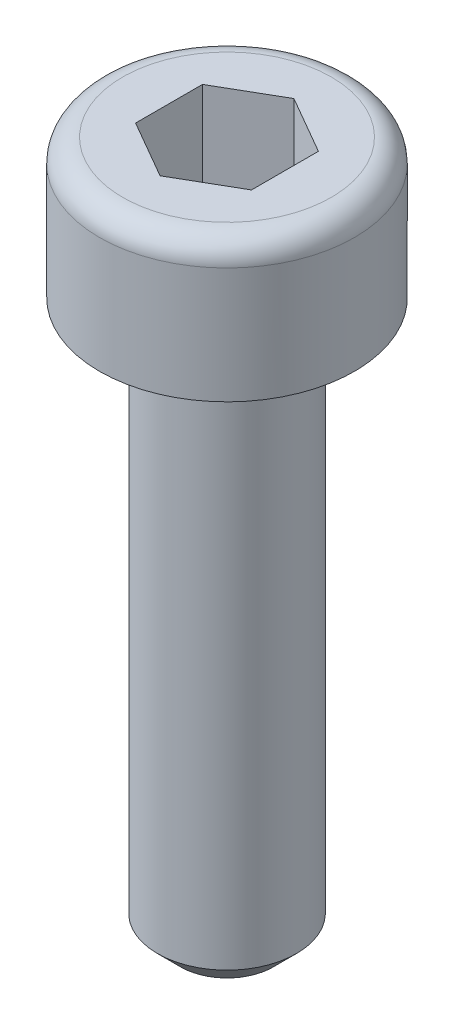
ISO-10303-21;
HEADER;
FILE_DESCRIPTION(('STEP AP214'),'2;1');
FILE_NAME('part.step','',(''),(''),'','','');
FILE_SCHEMA(('AUTOMOTIVE_DESIGN { 1 0 10303 214 1 1 1 1 }'));
ENDSEC;
DATA;
#1=APPLICATION_CONTEXT('core data for automotive mechanical design processes');
#2=APPLICATION_PROTOCOL_DEFINITION('international standard','automotive_design',2000,#1);
#3=PRODUCT_CONTEXT('',#1,'mechanical');
#4=PRODUCT('Part','Part','',(#3));
#5=PRODUCT_RELATED_PRODUCT_CATEGORY('part','',(#4));
#6=PRODUCT_DEFINITION_FORMATION('','',#4);
#7=PRODUCT_DEFINITION_CONTEXT('part definition',#1,'design');
#8=PRODUCT_DEFINITION('design','',#6,#7);
#9=PRODUCT_DEFINITION_SHAPE('','',#8);
#10=(LENGTH_UNIT() NAMED_UNIT(*) SI_UNIT(.MILLI.,.METRE.));
#11=(NAMED_UNIT(*) PLANE_ANGLE_UNIT() SI_UNIT($,.RADIAN.));
#12=(NAMED_UNIT(*) SI_UNIT($,.STERADIAN.) SOLID_ANGLE_UNIT());
#13=UNCERTAINTY_MEASURE_WITH_UNIT(LENGTH_MEASURE(1.E-05),#10,'distance_accuracy_value','');
#14=(GEOMETRIC_REPRESENTATION_CONTEXT(3) GLOBAL_UNCERTAINTY_ASSIGNED_CONTEXT((#13)) GLOBAL_UNIT_ASSIGNED_CONTEXT((#10,
#11,#12)) REPRESENTATION_CONTEXT('',''));
#15=CARTESIAN_POINT('',(0.,0.,0.));
#16=DIRECTION('',(0.,0.,1.));
#17=DIRECTION('',(1.,0.,0.));
#18=AXIS2_PLACEMENT_3D('',#15,#16,#17);
#19=CARTESIAN_POINT('',(0.,0.,0.));
#20=DIRECTION('',(0.,-1.,0.));
#21=DIRECTION('',(0.,0.,-1.));
#22=AXIS2_PLACEMENT_3D('',#19,#20,#21);
#23=PLANE('',#22);
#24=CARTESIAN_POINT('',(0.,0.,0.));
#25=DIRECTION('',(0.,-1.,0.));
#26=DIRECTION('',(0.,0.,-1.));
#27=AXIS2_PLACEMENT_3D('',#24,#25,#26);
#28=CIRCLE('',#27,2.25);
#29=CARTESIAN_POINT('',(0.,0.,-2.25));
#30=VERTEX_POINT('',#29);
#31=EDGE_CURVE('E42',#30,#30,#28,.F.);
#32=ORIENTED_EDGE('',*,*,#31,.T.);
#33=EDGE_LOOP('',(#32));
#34=FACE_BOUND('',#33,.T.);
#35=DIRECTION('',(-0.866025403784439,0.,-0.5));
#36=VECTOR('',#35,1.);
#37=CARTESIAN_POINT('',(1.25,0.,-0.721687836487032));
#38=LINE('',#37,#36);
#39=CARTESIAN_POINT('',(1.25,0.,-0.721687836487032));
#40=VERTEX_POINT('',#39);
#41=CARTESIAN_POINT('',(0.,0.,-1.44337567297406));
#42=VERTEX_POINT('',#41);
#43=EDGE_CURVE('E123',#40,#42,#38,.T.);
#44=ORIENTED_EDGE('',*,*,#43,.F.);
#45=DIRECTION('',(0.,0.,-1.));
#46=VECTOR('',#45,1.);
#47=CARTESIAN_POINT('',(1.25,0.,0.721687836487033));
#48=LINE('',#47,#46);
#49=CARTESIAN_POINT('',(1.25,0.,0.721687836487033));
#50=VERTEX_POINT('',#49);
#51=EDGE_CURVE('E49',#50,#40,#48,.T.);
#52=ORIENTED_EDGE('',*,*,#51,.F.);
#53=DIRECTION('',(0.866025403784439,0.,-0.5));
#54=VECTOR('',#53,1.);
#55=CARTESIAN_POINT('',(0.,0.,1.44337567297406));
#56=LINE('',#55,#54);
#57=CARTESIAN_POINT('',(0.,0.,1.44337567297406));
#58=VERTEX_POINT('',#57);
#59=EDGE_CURVE('E132',#58,#50,#56,.T.);
#60=ORIENTED_EDGE('',*,*,#59,.F.);
#61=DIRECTION('',(0.866025403784439,0.,0.5));
#62=VECTOR('',#61,1.);
#63=CARTESIAN_POINT('',(-1.25,0.,0.721687836487031));
#64=LINE('',#63,#62);
#65=CARTESIAN_POINT('',(-1.25,0.,0.721687836487031));
#66=VERTEX_POINT('',#65);
#67=EDGE_CURVE('E130',#66,#58,#64,.T.);
#68=ORIENTED_EDGE('',*,*,#67,.F.);
#69=DIRECTION('',(0.,0.,1.));
#70=VECTOR('',#69,1.);
#71=CARTESIAN_POINT('',(-1.25,0.,-0.721687836487033));
#72=LINE('',#71,#70);
#73=CARTESIAN_POINT('',(-1.25,0.,-0.721687836487033));
#74=VERTEX_POINT('',#73);
#75=EDGE_CURVE('E97',#74,#66,#72,.T.);
#76=ORIENTED_EDGE('',*,*,#75,.F.);
#77=DIRECTION('',(-0.866025403784439,0.,0.5));
#78=VECTOR('',#77,1.);
#79=CARTESIAN_POINT('',(0.,0.,-1.44337567297406));
#80=LINE('',#79,#78);
#81=EDGE_CURVE('E126',#42,#74,#80,.T.);
#82=ORIENTED_EDGE('',*,*,#81,.F.);
#83=EDGE_LOOP('',(#44,#52,#60,#68,#76,#82));
#84=FACE_BOUND('',#83,.T.);
#85=ADVANCED_FACE('F34',(#34,#84),#23,.F.);
#86=CARTESIAN_POINT('',(0.,0.,0.));
#87=DIRECTION('',(0.,1.,0.));
#88=DIRECTION('',(0.,0.,1.));
#89=AXIS2_PLACEMENT_3D('',#86,#87,#88);
#90=CYLINDRICAL_SURFACE('',#89,2.75);
#91=CARTESIAN_POINT('',(0.,-0.5,0.));
#92=DIRECTION('',(0.,-1.,0.));
#93=DIRECTION('',(0.,0.,-1.));
#94=AXIS2_PLACEMENT_3D('',#91,#92,#93);
#95=CIRCLE('',#94,2.75);
#96=CARTESIAN_POINT('',(0.,-0.5,-2.75));
#97=VERTEX_POINT('',#96);
#98=EDGE_CURVE('E11',#97,#97,#95,.T.);
#99=ORIENTED_EDGE('',*,*,#98,.T.);
#100=EDGE_LOOP('',(#99));
#101=FACE_BOUND('',#100,.T.);
#102=CARTESIAN_POINT('',(0.,-3.,0.));
#103=DIRECTION('',(0.,1.,0.));
#104=DIRECTION('',(0.,0.,1.));
#105=AXIS2_PLACEMENT_3D('',#102,#103,#104);
#106=CIRCLE('',#105,2.75);
#107=CARTESIAN_POINT('',(0.,-3.,2.75));
#108=VERTEX_POINT('',#107);
#109=EDGE_CURVE('E144',#108,#108,#106,.T.);
#110=ORIENTED_EDGE('',*,*,#109,.T.);
#111=EDGE_LOOP('',(#110));
#112=FACE_BOUND('',#111,.T.);
#113=ADVANCED_FACE('F166',(#101,#112),#90,.T.);
#114=CARTESIAN_POINT('',(2.75,-3.,0.));
#115=DIRECTION('',(0.,1.,0.));
#116=DIRECTION('',(0.,0.,1.));
#117=AXIS2_PLACEMENT_3D('',#114,#115,#116);
#118=PLANE('',#117);
#119=ORIENTED_EDGE('',*,*,#109,.F.);
#120=EDGE_LOOP('',(#119));
#121=FACE_BOUND('',#120,.T.);
#122=CARTESIAN_POINT('',(0.,-3.,0.));
#123=DIRECTION('',(0.,1.,0.));
#124=DIRECTION('',(0.,0.,1.));
#125=AXIS2_PLACEMENT_3D('',#122,#123,#124);
#126=CIRCLE('',#125,1.5);
#127=CARTESIAN_POINT('',(0.,-3.,1.5));
#128=VERTEX_POINT('',#127);
#129=EDGE_CURVE('E136',#128,#128,#126,.T.);
#130=ORIENTED_EDGE('',*,*,#129,.T.);
#131=EDGE_LOOP('',(#130));
#132=FACE_BOUND('',#131,.T.);
#133=ADVANCED_FACE('F171',(#121,#132),#118,.F.);
#134=CARTESIAN_POINT('',(0.,0.,0.));
#135=DIRECTION('',(0.,1.,0.));
#136=DIRECTION('',(0.,0.,1.));
#137=AXIS2_PLACEMENT_3D('',#134,#135,#136);
#138=CYLINDRICAL_SURFACE('',#137,1.5);
#139=CARTESIAN_POINT('',(0.,-14.5,0.));
#140=DIRECTION('',(0.,1.,0.));
#141=DIRECTION('',(0.,0.,1.));
#142=AXIS2_PLACEMENT_3D('',#139,#140,#141);
#143=CIRCLE('',#142,1.5);
#144=CARTESIAN_POINT('',(0.,-14.5,1.5));
#145=VERTEX_POINT('',#144);
#146=EDGE_CURVE('E147',#145,#145,#143,.T.);
#147=ORIENTED_EDGE('',*,*,#146,.T.);
#148=EDGE_LOOP('',(#147));
#149=FACE_BOUND('',#148,.T.);
#150=ORIENTED_EDGE('',*,*,#129,.F.);
#151=EDGE_LOOP('',(#150));
#152=FACE_BOUND('',#151,.T.);
#153=ADVANCED_FACE('F177',(#149,#152),#138,.T.);
#154=CARTESIAN_POINT('',(1.5,-15.,0.));
#155=DIRECTION('',(0.,1.,0.));
#156=DIRECTION('',(0.,0.,1.));
#157=AXIS2_PLACEMENT_3D('',#154,#155,#156);
#158=PLANE('',#157);
#159=CARTESIAN_POINT('',(0.,-15.,0.));
#160=DIRECTION('',(0.,1.,0.));
#161=DIRECTION('',(0.,0.,1.));
#162=AXIS2_PLACEMENT_3D('',#159,#160,#161);
#163=CIRCLE('',#162,1.);
#164=CARTESIAN_POINT('',(0.,-15.,1.));
#165=VERTEX_POINT('',#164);
#166=EDGE_CURVE('E150',#165,#165,#163,.F.);
#167=ORIENTED_EDGE('',*,*,#166,.T.);
#168=EDGE_LOOP('',(#167));
#169=FACE_BOUND('',#168,.T.);
#170=ADVANCED_FACE('F181',(#169),#158,.F.);
#171=CARTESIAN_POINT('',(1.25,-2.,0.721687836487033));
#172=DIRECTION('',(1.,0.,0.));
#173=DIRECTION('',(0.,0.,-1.));
#174=AXIS2_PLACEMENT_3D('',#171,#172,#173);
#175=PLANE('',#174);
#176=ORIENTED_EDGE('',*,*,#51,.T.);
#177=DIRECTION('',(0.,1.,0.));
#178=VECTOR('',#177,1.);
#179=CARTESIAN_POINT('',(1.25,-2.,-0.721687836487032));
#180=LINE('',#179,#178);
#181=CARTESIAN_POINT('',(1.25,-2.,-0.721687836487032));
#182=VERTEX_POINT('',#181);
#183=EDGE_CURVE('E79',#182,#40,#180,.T.);
#184=ORIENTED_EDGE('',*,*,#183,.F.);
#185=DIRECTION('',(0.,0.,-1.));
#186=VECTOR('',#185,1.);
#187=CARTESIAN_POINT('',(1.25,-2.,0.721687836487033));
#188=LINE('',#187,#186);
#189=CARTESIAN_POINT('',(1.25,-2.,0.721687836487033));
#190=VERTEX_POINT('',#189);
#191=EDGE_CURVE('E134',#190,#182,#188,.T.);
#192=ORIENTED_EDGE('',*,*,#191,.F.);
#193=DIRECTION('',(0.,1.,0.));
#194=VECTOR('',#193,1.);
#195=CARTESIAN_POINT('',(1.25,-2.,0.721687836487033));
#196=LINE('',#195,#194);
#197=EDGE_CURVE('E57',#190,#50,#196,.T.);
#198=ORIENTED_EDGE('',*,*,#197,.T.);
#199=EDGE_LOOP('',(#176,#184,#192,#198));
#200=FACE_BOUND('',#199,.T.);
#201=ADVANCED_FACE('F185',(#200),#175,.F.);
#202=CARTESIAN_POINT('',(0.,-2.,1.44337567297406));
#203=DIRECTION('',(0.5,0.,0.866025403784439));
#204=DIRECTION('',(0.866025403784439,0.,-0.5));
#205=AXIS2_PLACEMENT_3D('',#202,#203,#204);
#206=PLANE('',#205);
#207=ORIENTED_EDGE('',*,*,#59,.T.);
#208=ORIENTED_EDGE('',*,*,#197,.F.);
#209=DIRECTION('',(0.866025403784439,0.,-0.5));
#210=VECTOR('',#209,1.);
#211=CARTESIAN_POINT('',(0.,-2.,1.44337567297406));
#212=LINE('',#211,#210);
#213=CARTESIAN_POINT('',(0.,-2.,1.44337567297406));
#214=VERTEX_POINT('',#213);
#215=EDGE_CURVE('E109',#214,#190,#212,.T.);
#216=ORIENTED_EDGE('',*,*,#215,.F.);
#217=DIRECTION('',(0.,1.,0.));
#218=VECTOR('',#217,1.);
#219=CARTESIAN_POINT('',(0.,-2.,1.44337567297406));
#220=LINE('',#219,#218);
#221=EDGE_CURVE('E101',#214,#58,#220,.T.);
#222=ORIENTED_EDGE('',*,*,#221,.T.);
#223=EDGE_LOOP('',(#207,#208,#216,#222));
#224=FACE_BOUND('',#223,.T.);
#225=ADVANCED_FACE('F189',(#224),#206,.F.);
#226=CARTESIAN_POINT('',(-1.25,-2.,0.721687836487031));
#227=DIRECTION('',(-0.5,0.,0.866025403784439));
#228=DIRECTION('',(0.866025403784439,0.,0.5));
#229=AXIS2_PLACEMENT_3D('',#226,#227,#228);
#230=PLANE('',#229);
#231=ORIENTED_EDGE('',*,*,#67,.T.);
#232=ORIENTED_EDGE('',*,*,#221,.F.);
#233=DIRECTION('',(0.866025403784439,0.,0.5));
#234=VECTOR('',#233,1.);
#235=CARTESIAN_POINT('',(-1.25,-2.,0.721687836487031));
#236=LINE('',#235,#234);
#237=CARTESIAN_POINT('',(-1.25,-2.,0.721687836487031));
#238=VERTEX_POINT('',#237);
#239=EDGE_CURVE('E105',#238,#214,#236,.T.);
#240=ORIENTED_EDGE('',*,*,#239,.F.);
#241=DIRECTION('',(0.,1.,0.));
#242=VECTOR('',#241,1.);
#243=CARTESIAN_POINT('',(-1.25,-2.,0.721687836487031));
#244=LINE('',#243,#242);
#245=EDGE_CURVE('E90',#238,#66,#244,.T.);
#246=ORIENTED_EDGE('',*,*,#245,.T.);
#247=EDGE_LOOP('',(#231,#232,#240,#246));
#248=FACE_BOUND('',#247,.T.);
#249=ADVANCED_FACE('F106',(#248),#230,.F.);
#250=CARTESIAN_POINT('',(-1.25,-2.,-0.721687836487033));
#251=DIRECTION('',(-1.,0.,0.));
#252=DIRECTION('',(0.,0.,1.));
#253=AXIS2_PLACEMENT_3D('',#250,#251,#252);
#254=PLANE('',#253);
#255=ORIENTED_EDGE('',*,*,#75,.T.);
#256=ORIENTED_EDGE('',*,*,#245,.F.);
#257=DIRECTION('',(0.,0.,1.));
#258=VECTOR('',#257,1.);
#259=CARTESIAN_POINT('',(-1.25,-2.,-0.721687836487033));
#260=LINE('',#259,#258);
#261=CARTESIAN_POINT('',(-1.25,-2.,-0.721687836487033));
#262=VERTEX_POINT('',#261);
#263=EDGE_CURVE('E94',#262,#238,#260,.T.);
#264=ORIENTED_EDGE('',*,*,#263,.F.);
#265=DIRECTION('',(0.,1.,0.));
#266=VECTOR('',#265,1.);
#267=CARTESIAN_POINT('',(-1.25,-2.,-0.721687836487033));
#268=LINE('',#267,#266);
#269=EDGE_CURVE('E102',#262,#74,#268,.T.);
#270=ORIENTED_EDGE('',*,*,#269,.T.);
#271=EDGE_LOOP('',(#255,#256,#264,#270));
#272=FACE_BOUND('',#271,.T.);
#273=ADVANCED_FACE('F92',(#272),#254,.F.);
#274=CARTESIAN_POINT('',(0.,-2.,-1.44337567297406));
#275=DIRECTION('',(-0.5,0.,-0.866025403784439));
#276=DIRECTION('',(-0.866025403784439,0.,0.5));
#277=AXIS2_PLACEMENT_3D('',#274,#275,#276);
#278=PLANE('',#277);
#279=ORIENTED_EDGE('',*,*,#81,.T.);
#280=ORIENTED_EDGE('',*,*,#269,.F.);
#281=DIRECTION('',(-0.866025403784439,0.,0.5));
#282=VECTOR('',#281,1.);
#283=CARTESIAN_POINT('',(0.,-2.,-1.44337567297406));
#284=LINE('',#283,#282);
#285=CARTESIAN_POINT('',(0.,-2.,-1.44337567297406));
#286=VERTEX_POINT('',#285);
#287=EDGE_CURVE('E115',#286,#262,#284,.T.);
#288=ORIENTED_EDGE('',*,*,#287,.F.);
#289=DIRECTION('',(0.,1.,0.));
#290=VECTOR('',#289,1.);
#291=CARTESIAN_POINT('',(0.,-2.,-1.44337567297406));
#292=LINE('',#291,#290);
#293=EDGE_CURVE('E139',#286,#42,#292,.T.);
#294=ORIENTED_EDGE('',*,*,#293,.T.);
#295=EDGE_LOOP('',(#279,#280,#288,#294));
#296=FACE_BOUND('',#295,.T.);
#297=ADVANCED_FACE('F193',(#296),#278,.F.);
#298=CARTESIAN_POINT('',(1.25,-2.,-0.721687836487032));
#299=DIRECTION('',(0.5,0.,-0.866025403784439));
#300=DIRECTION('',(-0.866025403784439,0.,-0.5));
#301=AXIS2_PLACEMENT_3D('',#298,#299,#300);
#302=PLANE('',#301);
#303=ORIENTED_EDGE('',*,*,#43,.T.);
#304=ORIENTED_EDGE('',*,*,#293,.F.);
#305=DIRECTION('',(-0.866025403784439,0.,-0.5));
#306=VECTOR('',#305,1.);
#307=CARTESIAN_POINT('',(1.25,-2.,-0.721687836487032));
#308=LINE('',#307,#306);
#309=EDGE_CURVE('E117',#182,#286,#308,.T.);
#310=ORIENTED_EDGE('',*,*,#309,.F.);
#311=ORIENTED_EDGE('',*,*,#183,.T.);
#312=EDGE_LOOP('',(#303,#304,#310,#311));
#313=FACE_BOUND('',#312,.T.);
#314=ADVANCED_FACE('F190',(#313),#302,.F.);
#315=CARTESIAN_POINT('',(1.25,-2.,-0.721687836487032));
#316=DIRECTION('',(0.,1.,0.));
#317=DIRECTION('',(0.,0.,1.));
#318=AXIS2_PLACEMENT_3D('',#315,#316,#317);
#319=PLANE('',#318);
#320=ORIENTED_EDGE('',*,*,#191,.T.);
#321=ORIENTED_EDGE('',*,*,#309,.T.);
#322=ORIENTED_EDGE('',*,*,#287,.T.);
#323=ORIENTED_EDGE('',*,*,#263,.T.);
#324=ORIENTED_EDGE('',*,*,#239,.T.);
#325=ORIENTED_EDGE('',*,*,#215,.T.);
#326=EDGE_LOOP('',(#320,#321,#322,#323,#324,#325));
#327=FACE_BOUND('',#326,.T.);
#328=ADVANCED_FACE('F112',(#327),#319,.T.);
#329=CARTESIAN_POINT('',(0.,-14.5,0.));
#330=DIRECTION('',(0.,1.,0.));
#331=DIRECTION('',(0.,0.,1.));
#332=AXIS2_PLACEMENT_3D('',#329,#330,#331);
#333=CONICAL_SURFACE('',#332,1.5,0.785398163397451);
#334=ORIENTED_EDGE('',*,*,#166,.F.);
#335=EDGE_LOOP('',(#334));
#336=FACE_BOUND('',#335,.T.);
#337=ORIENTED_EDGE('',*,*,#146,.F.);
#338=EDGE_LOOP('',(#337));
#339=FACE_BOUND('',#338,.T.);
#340=ADVANCED_FACE('F158',(#336,#339),#333,.T.);
#341=CARTESIAN_POINT('',(0.,-0.5,0.));
#342=DIRECTION('',(0.,-1.,0.));
#343=DIRECTION('',(0.,0.,-1.));
#344=AXIS2_PLACEMENT_3D('',#341,#342,#343);
#345=TOROIDAL_SURFACE('',#344,2.25,0.5);
#346=ORIENTED_EDGE('',*,*,#98,.F.);
#347=EDGE_LOOP('',(#346));
#348=FACE_BOUND('',#347,.T.);
#349=ORIENTED_EDGE('',*,*,#31,.F.);
#350=EDGE_LOOP('',(#349));
#351=FACE_BOUND('',#350,.T.);
#352=ADVANCED_FACE('F36',(#348,#351),#345,.T.);
#353=CLOSED_SHELL('',(#85,#113,#133,#153,#170,#201,#225,#249,#273,#297,#314,#328,#340,#352));
#354=MANIFOLD_SOLID_BREP('B2',#353);
#355=ADVANCED_BREP_SHAPE_REPRESENTATION('',(#18,#354),#14);
#356=SHAPE_DEFINITION_REPRESENTATION(#9,#355);
ENDSEC;
END-ISO-10303-21;
